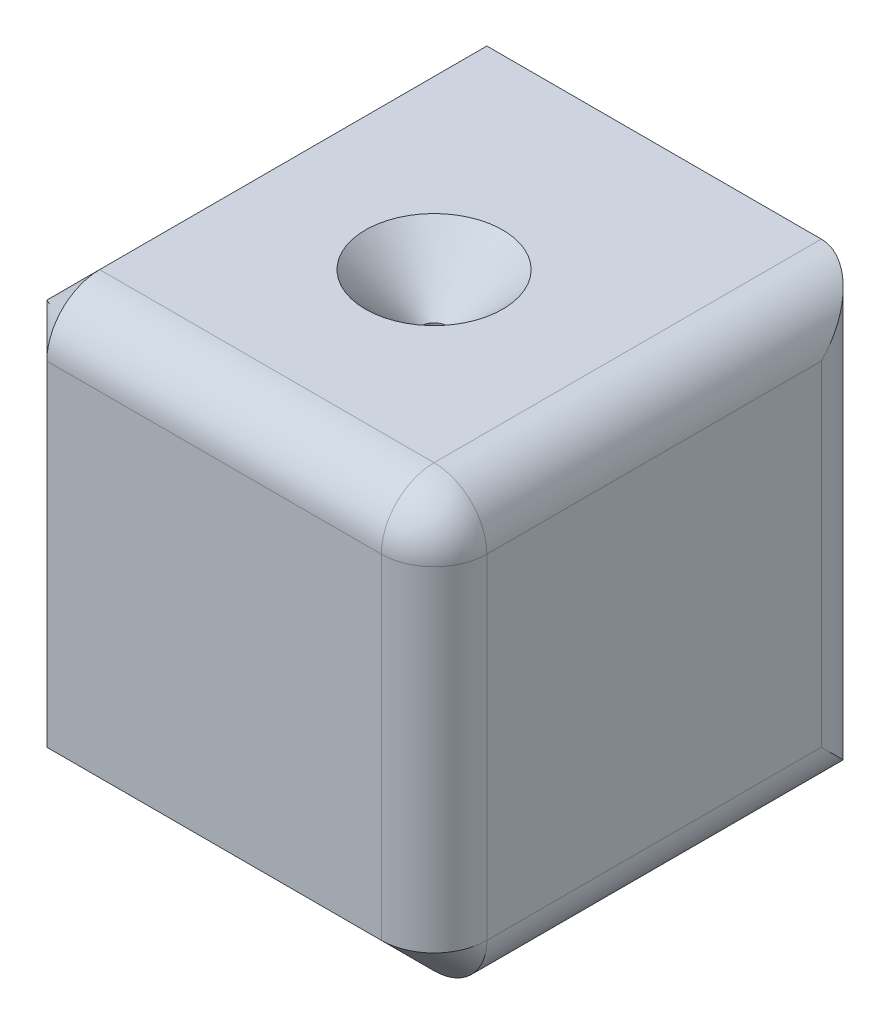
ISO-10303-21;
HEADER;
FILE_DESCRIPTION(('STEP AP214'),'2;1');
FILE_NAME('part.step','',(''),(''),'','','');
FILE_SCHEMA(('AUTOMOTIVE_DESIGN { 1 0 10303 214 1 1 1 1 }'));
ENDSEC;
DATA;
#1=APPLICATION_CONTEXT('core data for automotive mechanical design processes');
#2=APPLICATION_PROTOCOL_DEFINITION('international standard','automotive_design',2000,#1);
#3=PRODUCT_CONTEXT('',#1,'mechanical');
#4=PRODUCT('Part','Part','',(#3));
#5=PRODUCT_RELATED_PRODUCT_CATEGORY('part','',(#4));
#6=PRODUCT_DEFINITION_FORMATION('','',#4);
#7=PRODUCT_DEFINITION_CONTEXT('part definition',#1,'design');
#8=PRODUCT_DEFINITION('design','',#6,#7);
#9=PRODUCT_DEFINITION_SHAPE('','',#8);
#10=(LENGTH_UNIT() NAMED_UNIT(*) SI_UNIT(.MILLI.,.METRE.));
#11=(NAMED_UNIT(*) PLANE_ANGLE_UNIT() SI_UNIT($,.RADIAN.));
#12=(NAMED_UNIT(*) SI_UNIT($,.STERADIAN.) SOLID_ANGLE_UNIT());
#13=UNCERTAINTY_MEASURE_WITH_UNIT(LENGTH_MEASURE(1.E-05),#10,'distance_accuracy_value','');
#14=(GEOMETRIC_REPRESENTATION_CONTEXT(3) GLOBAL_UNCERTAINTY_ASSIGNED_CONTEXT((#13)) GLOBAL_UNIT_ASSIGNED_CONTEXT((#10,
#11,#12)) REPRESENTATION_CONTEXT('',''));
#15=CARTESIAN_POINT('',(0.,0.,0.));
#16=DIRECTION('',(0.,0.,1.));
#17=DIRECTION('',(1.,0.,0.));
#18=AXIS2_PLACEMENT_3D('',#15,#16,#17);
#19=CARTESIAN_POINT('',(0.,0.,25.));
#20=DIRECTION('',(1.,0.,0.));
#21=DIRECTION('',(0.,0.,-1.));
#22=AXIS2_PLACEMENT_3D('',#19,#20,#21);
#23=PLANE('',#22);
#24=DIRECTION('',(0.,0.,-1.));
#25=VECTOR('',#24,1.);
#26=CARTESIAN_POINT('',(0.,22.,25.));
#27=LINE('',#26,#25);
#28=CARTESIAN_POINT('',(0.,22.,22.));
#29=VERTEX_POINT('',#28);
#30=CARTESIAN_POINT('',(0.,22.,2.));
#31=VERTEX_POINT('',#30);
#32=EDGE_CURVE('E358',#29,#31,#27,.T.);
#33=ORIENTED_EDGE('',*,*,#32,.T.);
#34=CARTESIAN_POINT('',(0.,72.,2.));
#35=CARTESIAN_POINT('',(0.,55.3333333333333,2.));
#36=CARTESIAN_POINT('',(0.,38.6666666666667,2.));
#37=CARTESIAN_POINT('',(0.,22.,2.));
#38=CARTESIAN_POINT('',(0.,20.1666666666667,2.));
#39=CARTESIAN_POINT('',(0.,18.3333333333333,1.));
#40=CARTESIAN_POINT('',(0.,16.5,1.));
#41=CARTESIAN_POINT('',(0.,11.,1.));
#42=CARTESIAN_POINT('',(0.,5.49999999999999,4.));
#43=CARTESIAN_POINT('',(0.,0.,4.));
#44=CARTESIAN_POINT('',(0.,-16.,4.));
#45=CARTESIAN_POINT('',(0.,-32.,4.));
#46=CARTESIAN_POINT('',(0.,-48.,4.));
#47=(BOUNDED_CURVE() B_SPLINE_CURVE(3,(#34,#35,#36,#37,#38,#39,#40,#41,#42,#43,#44,#45,#46),
.UNSPECIFIED.,.F.,.F.) B_SPLINE_CURVE_WITH_KNOTS((4,3,3,3,4),(-0.072,-0.022,-0.0165,0.,0.048),
.UNSPECIFIED.) CURVE() GEOMETRIC_REPRESENTATION_ITEM() RATIONAL_B_SPLINE_CURVE((1.,1.,1.,1.,1.,
1.,1.,1.,1.,1.,1.,1.,1.)) REPRESENTATION_ITEM(''));
#48=CARTESIAN_POINT('',(0.,0.,4.));
#49=VERTEX_POINT('',#48);
#50=EDGE_CURVE('E229',#31,#49,#47,.T.);
#51=ORIENTED_EDGE('',*,*,#50,.T.);
#52=DIRECTION('',(0.,0.,-1.));
#53=VECTOR('',#52,1.);
#54=CARTESIAN_POINT('',(0.,0.,25.));
#55=LINE('',#54,#53);
#56=CARTESIAN_POINT('',(0.,0.,22.));
#57=VERTEX_POINT('',#56);
#58=EDGE_CURVE('E148',#57,#49,#55,.T.);
#59=ORIENTED_EDGE('',*,*,#58,.F.);
#60=DIRECTION('',(0.,1.,0.));
#61=VECTOR('',#60,1.);
#62=CARTESIAN_POINT('',(0.,0.,22.));
#63=LINE('',#62,#61);
#64=EDGE_CURVE('E361',#57,#29,#63,.T.);
#65=ORIENTED_EDGE('',*,*,#64,.T.);
#66=EDGE_LOOP('',(#33,#51,#59,#65));
#67=FACE_BOUND('',#66,.T.);
#68=ADVANCED_FACE('F43',(#67),#23,.F.);
#69=CARTESIAN_POINT('',(0.,0.,25.));
#70=DIRECTION('',(0.,1.,0.));
#71=DIRECTION('',(0.,0.,1.));
#72=AXIS2_PLACEMENT_3D('',#69,#70,#71);
#73=PLANE('',#72);
#74=CARTESIAN_POINT('',(12.5,0.,12.5));
#75=DIRECTION('',(0.,1.,0.));
#76=DIRECTION('',(0.,0.,1.));
#77=AXIS2_PLACEMENT_3D('',#74,#75,#76);
#78=CIRCLE('',#77,0.749999999999997);
#79=CARTESIAN_POINT('',(12.5,0.,13.25));
#80=VERTEX_POINT('',#79);
#81=EDGE_CURVE('E200',#80,#80,#78,.T.);
#82=ORIENTED_EDGE('',*,*,#81,.T.);
#83=EDGE_LOOP('',(#82));
#84=FACE_BOUND('',#83,.T.);
#85=ORIENTED_EDGE('',*,*,#58,.T.);
#86=CARTESIAN_POINT('',(0.,0.,4.));
#87=CARTESIAN_POINT('',(-1.07801650055505E-05,0.,3.88749351533069));
#88=CARTESIAN_POINT('',(0.00474660216352325,0.,3.77499214031857));
#89=CARTESIAN_POINT('',(0.0237142676639782,0.,3.55079431915907));
#90=CARTESIAN_POINT('',(0.0379240973846,0.,3.43909783465941));
#91=CARTESIAN_POINT('',(0.0756989713572863,0.,3.21737735873569));
#92=CARTESIAN_POINT('',(0.099256938530871,0.,3.10735216732034));
#93=CARTESIAN_POINT('',(0.155536996447878,0.,2.88970424637514));
#94=CARTESIAN_POINT('',(0.188258975324464,0.,2.78208148753564));
#95=CARTESIAN_POINT('',(0.299906592833127,0.,2.4638552761497));
#96=CARTESIAN_POINT('',(0.392329366770349,0.,2.2578036601231));
#97=CARTESIAN_POINT('',(0.610395015416492,0.,1.8642930528176));
#98=CARTESIAN_POINT('',(0.736032037981211,0.,1.67683079420276));
#99=CARTESIAN_POINT('',(1.01700181102197,0.,1.325628419682));
#100=CARTESIAN_POINT('',(1.17233427169146,0.,1.16188807229434));
#101=CARTESIAN_POINT('',(1.50831732546925,0.,0.862784943115788));
#102=CARTESIAN_POINT('',(1.68897286554306,0.,0.727427719008996));
#103=CARTESIAN_POINT('',(2.07046311746318,0.,0.488943692525063));
#104=CARTESIAN_POINT('',(2.27130176975455,0.,0.385823200096089));
#105=CARTESIAN_POINT('',(2.68740125719416,0.,0.214817855130698));
#106=CARTESIAN_POINT('',(2.90265356163622,0.,0.146912365149822));
#107=CARTESIAN_POINT('',(3.2660192610585,0.,0.0651394785829523));
#108=CARTESIAN_POINT('',(3.41184681111315,0.,0.0407269308072327));
#109=CARTESIAN_POINT('',(3.70509586554667,0.,0.00815932773058737));
#110=CARTESIAN_POINT('',(3.8525148110416,0.,-1.87754480882476E-05));
#111=CARTESIAN_POINT('',(4.,0.,0.));
#112=B_SPLINE_CURVE_WITH_KNOTS('',3,(#86,#87,#88,#89,#90,#91,#92,#93,#94,#95,#96,#97,#98,#99,
#100,#101,#102,#103,#104,#105,#106,#107,#108,#109,#110,#111),.UNSPECIFIED.,.F.,.F.,(4,2,2,2,2,2,
2,2,2,2,2,2,4),(0.,0.337409690213686,0.674803195430495,1.01194176015819,1.34907620955064,
2.02307394016271,2.69695299561842,3.37082547482512,4.04482978167747,4.71896593419016,
5.39270656736782,5.83543557899262,6.27753560189516),.UNSPECIFIED.);
#113=CARTESIAN_POINT('',(4.,0.,0.));
#114=VERTEX_POINT('',#113);
#115=EDGE_CURVE('E73',#49,#114,#112,.T.);
#116=ORIENTED_EDGE('',*,*,#115,.T.);
#117=DIRECTION('',(1.,0.,0.));
#118=VECTOR('',#117,1.);
#119=CARTESIAN_POINT('',(0.,0.,0.));
#120=LINE('',#119,#118);
#121=CARTESIAN_POINT('',(22.,0.,0.));
#122=VERTEX_POINT('',#121);
#123=EDGE_CURVE('E198',#114,#122,#120,.T.);
#124=ORIENTED_EDGE('',*,*,#123,.T.);
#125=DIRECTION('',(0.,0.,-1.));
#126=VECTOR('',#125,1.);
#127=CARTESIAN_POINT('',(22.,0.,25.));
#128=LINE('',#127,#126);
#129=CARTESIAN_POINT('',(22.,0.,22.));
#130=VERTEX_POINT('',#129);
#131=EDGE_CURVE('E135',#122,#130,#128,.F.);
#132=ORIENTED_EDGE('',*,*,#131,.T.);
#133=DIRECTION('',(-1.,0.,0.));
#134=VECTOR('',#133,1.);
#135=CARTESIAN_POINT('',(0.,0.,22.));
#136=LINE('',#135,#134);
#137=EDGE_CURVE('E363',#130,#57,#136,.T.);
#138=ORIENTED_EDGE('',*,*,#137,.T.);
#139=EDGE_LOOP('',(#85,#116,#124,#132,#138));
#140=FACE_BOUND('',#139,.T.);
#141=ADVANCED_FACE('F316',(#84,#140),#73,.F.);
#142=CARTESIAN_POINT('',(25.,0.,25.));
#143=DIRECTION('',(-1.,0.,0.));
#144=DIRECTION('',(0.,0.,1.));
#145=AXIS2_PLACEMENT_3D('',#142,#143,#144);
#146=PLANE('',#145);
#147=DIRECTION('',(0.,1.,0.));
#148=VECTOR('',#147,1.);
#149=CARTESIAN_POINT('',(25.,0.,22.));
#150=LINE('',#149,#148);
#151=CARTESIAN_POINT('',(25.,22.,22.));
#152=VERTEX_POINT('',#151);
#153=CARTESIAN_POINT('',(25.,3.,22.));
#154=VERTEX_POINT('',#153);
#155=EDGE_CURVE('E153',#152,#154,#150,.F.);
#156=ORIENTED_EDGE('',*,*,#155,.T.);
#157=DIRECTION('',(0.,0.,-1.));
#158=VECTOR('',#157,1.);
#159=CARTESIAN_POINT('',(25.,3.,25.));
#160=LINE('',#159,#158);
#161=CARTESIAN_POINT('',(25.,3.,3.));
#162=VERTEX_POINT('',#161);
#163=EDGE_CURVE('E132',#154,#162,#160,.T.);
#164=ORIENTED_EDGE('',*,*,#163,.T.);
#165=DIRECTION('',(0.,1.,0.));
#166=VECTOR('',#165,1.);
#167=CARTESIAN_POINT('',(25.,25.,3.));
#168=LINE('',#167,#166);
#169=CARTESIAN_POINT('',(25.,22.,3.));
#170=VERTEX_POINT('',#169);
#171=EDGE_CURVE('E142',#162,#170,#168,.T.);
#172=ORIENTED_EDGE('',*,*,#171,.T.);
#173=DIRECTION('',(0.,0.,-1.));
#174=VECTOR('',#173,1.);
#175=CARTESIAN_POINT('',(25.,22.,25.));
#176=LINE('',#175,#174);
#177=EDGE_CURVE('E147',#170,#152,#176,.F.);
#178=ORIENTED_EDGE('',*,*,#177,.T.);
#179=EDGE_LOOP('',(#156,#164,#172,#178));
#180=FACE_BOUND('',#179,.T.);
#181=ADVANCED_FACE('F151',(#180),#146,.F.);
#182=CARTESIAN_POINT('',(0.,25.,25.));
#183=DIRECTION('',(0.,-1.,0.));
#184=DIRECTION('',(0.,0.,-1.));
#185=AXIS2_PLACEMENT_3D('',#182,#183,#184);
#186=PLANE('',#185);
#187=CARTESIAN_POINT('',(12.5,25.,12.5));
#188=DIRECTION('',(0.,1.,0.));
#189=DIRECTION('',(0.,0.,1.));
#190=AXIS2_PLACEMENT_3D('',#187,#188,#189);
#191=CIRCLE('',#190,3.9);
#192=CARTESIAN_POINT('',(12.5,25.,16.4));
#193=VERTEX_POINT('',#192);
#194=EDGE_CURVE('E188',#193,#193,#191,.T.);
#195=ORIENTED_EDGE('',*,*,#194,.F.);
#196=EDGE_LOOP('',(#195));
#197=FACE_BOUND('',#196,.T.);
#198=DIRECTION('',(-1.,0.,0.));
#199=VECTOR('',#198,1.);
#200=CARTESIAN_POINT('',(0.,25.,0.));
#201=LINE('',#200,#199);
#202=CARTESIAN_POINT('',(22.,25.,0.));
#203=VERTEX_POINT('',#202);
#204=CARTESIAN_POINT('',(3.00000000000001,25.,0.));
#205=VERTEX_POINT('',#204);
#206=EDGE_CURVE('E195',#203,#205,#201,.T.);
#207=ORIENTED_EDGE('',*,*,#206,.T.);
#208=DIRECTION('',(0.,0.,1.));
#209=VECTOR('',#208,1.);
#210=CARTESIAN_POINT('',(3.00000000000001,25.,25.));
#211=LINE('',#210,#209);
#212=CARTESIAN_POINT('',(3.00000000000001,25.,22.));
#213=VERTEX_POINT('',#212);
#214=EDGE_CURVE('E218',#205,#213,#211,.T.);
#215=ORIENTED_EDGE('',*,*,#214,.T.);
#216=DIRECTION('',(-1.,0.,0.));
#217=VECTOR('',#216,1.);
#218=CARTESIAN_POINT('',(0.,25.,22.));
#219=LINE('',#218,#217);
#220=CARTESIAN_POINT('',(22.,25.,22.));
#221=VERTEX_POINT('',#220);
#222=EDGE_CURVE('E166',#213,#221,#219,.F.);
#223=ORIENTED_EDGE('',*,*,#222,.T.);
#224=DIRECTION('',(0.,0.,-1.));
#225=VECTOR('',#224,1.);
#226=CARTESIAN_POINT('',(22.,25.,25.));
#227=LINE('',#226,#225);
#228=EDGE_CURVE('E173',#221,#203,#227,.T.);
#229=ORIENTED_EDGE('',*,*,#228,.T.);
#230=EDGE_LOOP('',(#207,#215,#223,#229));
#231=FACE_BOUND('',#230,.T.);
#232=ADVANCED_FACE('F211',(#197,#231),#186,.F.);
#233=CARTESIAN_POINT('',(0.,0.,25.));
#234=DIRECTION('',(0.,0.,-1.));
#235=DIRECTION('',(-1.,0.,0.));
#236=AXIS2_PLACEMENT_3D('',#233,#234,#235);
#237=PLANE('',#236);
#238=DIRECTION('',(-1.,0.,0.));
#239=VECTOR('',#238,1.);
#240=CARTESIAN_POINT('',(0.,22.,25.));
#241=LINE('',#240,#239);
#242=CARTESIAN_POINT('',(22.,22.,25.));
#243=VERTEX_POINT('',#242);
#244=CARTESIAN_POINT('',(3.00000000000001,22.,25.));
#245=VERTEX_POINT('',#244);
#246=EDGE_CURVE('E155',#243,#245,#241,.T.);
#247=ORIENTED_EDGE('',*,*,#246,.T.);
#248=DIRECTION('',(0.,-1.,0.));
#249=VECTOR('',#248,1.);
#250=CARTESIAN_POINT('',(3.00000000000001,0.,25.));
#251=LINE('',#250,#249);
#252=CARTESIAN_POINT('',(3.00000000000001,3.00000000000001,25.));
#253=VERTEX_POINT('',#252);
#254=EDGE_CURVE('E354',#245,#253,#251,.T.);
#255=ORIENTED_EDGE('',*,*,#254,.T.);
#256=DIRECTION('',(1.,0.,0.));
#257=VECTOR('',#256,1.);
#258=CARTESIAN_POINT('',(0.,3.00000000000001,25.));
#259=LINE('',#258,#257);
#260=CARTESIAN_POINT('',(22.,3.00000000000001,25.));
#261=VERTEX_POINT('',#260);
#262=EDGE_CURVE('E347',#253,#261,#259,.T.);
#263=ORIENTED_EDGE('',*,*,#262,.T.);
#264=DIRECTION('',(0.,1.,0.));
#265=VECTOR('',#264,1.);
#266=CARTESIAN_POINT('',(22.,0.,25.));
#267=LINE('',#266,#265);
#268=EDGE_CURVE('E163',#261,#243,#267,.T.);
#269=ORIENTED_EDGE('',*,*,#268,.T.);
#270=EDGE_LOOP('',(#247,#255,#263,#269));
#271=FACE_BOUND('',#270,.T.);
#272=ADVANCED_FACE('F214',(#271),#237,.F.);
#273=CARTESIAN_POINT('',(0.,0.,0.));
#274=DIRECTION('',(0.,0.,-1.));
#275=DIRECTION('',(-1.,0.,0.));
#276=AXIS2_PLACEMENT_3D('',#273,#274,#275);
#277=PLANE('',#276);
#278=ORIENTED_EDGE('',*,*,#123,.F.);
#279=CARTESIAN_POINT('',(2.,72.,0.));
#280=CARTESIAN_POINT('',(2.,55.3333333333333,0.));
#281=CARTESIAN_POINT('',(2.,38.6666666666667,0.));
#282=CARTESIAN_POINT('',(2.,22.,0.));
#283=CARTESIAN_POINT('',(2.,20.1666666666667,0.));
#284=CARTESIAN_POINT('',(1.,18.3333333333333,0.));
#285=CARTESIAN_POINT('',(1.,16.5,0.));
#286=CARTESIAN_POINT('',(1.,11.,0.));
#287=CARTESIAN_POINT('',(4.,5.49999999999999,0.));
#288=CARTESIAN_POINT('',(4.,0.,0.));
#289=CARTESIAN_POINT('',(4.,-16.,0.));
#290=CARTESIAN_POINT('',(4.,-32.,0.));
#291=CARTESIAN_POINT('',(4.,-48.,0.));
#292=(BOUNDED_CURVE() B_SPLINE_CURVE(3,(#279,#280,#281,#282,#283,#284,#285,#286,#287,#288,#289,
#290,#291),.UNSPECIFIED.,.F.,.F.) B_SPLINE_CURVE_WITH_KNOTS((4,3,3,3,4),(-0.072,-0.022,-0.0165,
0.,0.048),.UNSPECIFIED.) CURVE() GEOMETRIC_REPRESENTATION_ITEM() RATIONAL_B_SPLINE_CURVE((1.,1.,
1.,1.,1.,1.,1.,1.,1.,1.,1.,1.,1.)) REPRESENTATION_ITEM(''));
#293=CARTESIAN_POINT('',(2.,24.,0.));
#294=VERTEX_POINT('',#293);
#295=EDGE_CURVE('E59',#114,#294,#292,.F.);
#296=ORIENTED_EDGE('',*,*,#295,.T.);
#297=DIRECTION('',(-0.707106781186548,-0.707106781186548,0.));
#298=VECTOR('',#297,1.);
#299=CARTESIAN_POINT('',(-11.,11.,0.));
#300=LINE('',#299,#298);
#301=EDGE_CURVE('E224',#294,#205,#300,.F.);
#302=ORIENTED_EDGE('',*,*,#301,.T.);
#303=ORIENTED_EDGE('',*,*,#206,.F.);
#304=DIRECTION('',(0.,1.,0.));
#305=VECTOR('',#304,1.);
#306=CARTESIAN_POINT('',(22.,0.,0.));
#307=LINE('',#306,#305);
#308=EDGE_CURVE('E175',#203,#122,#307,.F.);
#309=ORIENTED_EDGE('',*,*,#308,.T.);
#310=EDGE_LOOP('',(#278,#296,#302,#303,#309));
#311=FACE_BOUND('',#310,.T.);
#312=ADVANCED_FACE('F387',(#311),#277,.T.);
#313=CARTESIAN_POINT('',(12.5,25.,12.5));
#314=DIRECTION('',(0.,1.,0.));
#315=DIRECTION('',(0.,0.,1.));
#316=AXIS2_PLACEMENT_3D('',#313,#314,#315);
#317=CYLINDRICAL_SURFACE('',#316,0.749999999999997);
#318=ORIENTED_EDGE('',*,*,#81,.F.);
#319=EDGE_LOOP('',(#318));
#320=FACE_BOUND('',#319,.T.);
#321=CARTESIAN_POINT('',(12.5,21.85,12.5));
#322=DIRECTION('',(0.,1.,0.));
#323=DIRECTION('',(0.,0.,1.));
#324=AXIS2_PLACEMENT_3D('',#321,#322,#323);
#325=CIRCLE('',#324,0.749999999999997);
#326=CARTESIAN_POINT('',(12.5,21.85,13.25));
#327=VERTEX_POINT('',#326);
#328=EDGE_CURVE('E203',#327,#327,#325,.T.);
#329=ORIENTED_EDGE('',*,*,#328,.T.);
#330=EDGE_LOOP('',(#329));
#331=FACE_BOUND('',#330,.T.);
#332=ADVANCED_FACE('F455',(#320,#331),#317,.F.);
#333=CARTESIAN_POINT('',(12.5,25.,12.5));
#334=DIRECTION('',(0.,1.,0.));
#335=DIRECTION('',(0.,0.,1.));
#336=AXIS2_PLACEMENT_3D('',#333,#334,#335);
#337=CONICAL_SURFACE('',#336,3.9,0.785398163397443);
#338=CARTESIAN_POINT('',(12.5,21.85,13.25));
#339=CARTESIAN_POINT('',(12.5,21.8828125,13.2828125));
#340=CARTESIAN_POINT('',(12.5,21.915625,13.315625));
#341=CARTESIAN_POINT('',(12.5,21.98125,13.38125));
#342=CARTESIAN_POINT('',(12.5,22.0140625,13.4140625));
#343=CARTESIAN_POINT('',(12.5,22.0796875,13.4796875));
#344=CARTESIAN_POINT('',(12.5,22.1125,13.5125));
#345=CARTESIAN_POINT('',(12.5,22.178125,13.578125));
#346=CARTESIAN_POINT('',(12.5,22.2109375,13.6109375));
#347=CARTESIAN_POINT('',(12.5,22.2765625,13.6765625));
#348=CARTESIAN_POINT('',(12.5,22.309375,13.709375));
#349=CARTESIAN_POINT('',(12.5,22.375,13.775));
#350=CARTESIAN_POINT('',(12.5,22.4078125,13.8078125));
#351=CARTESIAN_POINT('',(12.5,22.4734375,13.8734375));
#352=CARTESIAN_POINT('',(12.5,22.50625,13.90625));
#353=CARTESIAN_POINT('',(12.5,22.571875,13.971875));
#354=CARTESIAN_POINT('',(12.5,22.6046875,14.0046875));
#355=CARTESIAN_POINT('',(12.5,22.6703125,14.0703125));
#356=CARTESIAN_POINT('',(12.5,22.703125,14.103125));
#357=CARTESIAN_POINT('',(12.5,22.76875,14.16875));
#358=CARTESIAN_POINT('',(12.5,22.8015625,14.2015625));
#359=CARTESIAN_POINT('',(12.5,22.8671875,14.2671875));
#360=CARTESIAN_POINT('',(12.5,22.9,14.3));
#361=CARTESIAN_POINT('',(12.5,22.965625,14.365625));
#362=CARTESIAN_POINT('',(12.5,22.9984375,14.3984375));
#363=CARTESIAN_POINT('',(12.5,23.0640625,14.4640625));
#364=CARTESIAN_POINT('',(12.5,23.096875,14.496875));
#365=CARTESIAN_POINT('',(12.5,23.1625,14.5625));
#366=CARTESIAN_POINT('',(12.5,23.1953125,14.5953125));
#367=CARTESIAN_POINT('',(12.5,23.2609375,14.6609375));
#368=CARTESIAN_POINT('',(12.5,23.29375,14.69375));
#369=CARTESIAN_POINT('',(12.5,23.359375,14.759375));
#370=CARTESIAN_POINT('',(12.5,23.3921875,14.7921875));
#371=CARTESIAN_POINT('',(12.5,23.4578125,14.8578125));
#372=CARTESIAN_POINT('',(12.5,23.490625,14.890625));
#373=CARTESIAN_POINT('',(12.5,23.55625,14.95625));
#374=CARTESIAN_POINT('',(12.5,23.5890625,14.9890625));
#375=CARTESIAN_POINT('',(12.5,23.6546875,15.0546875));
#376=CARTESIAN_POINT('',(12.5,23.6875,15.0875));
#377=CARTESIAN_POINT('',(12.5,23.753125,15.153125));
#378=CARTESIAN_POINT('',(12.5,23.7859375,15.1859375));
#379=CARTESIAN_POINT('',(12.5,23.8515625,15.2515625));
#380=CARTESIAN_POINT('',(12.5,23.884375,15.284375));
#381=CARTESIAN_POINT('',(12.5,23.95,15.35));
#382=CARTESIAN_POINT('',(12.5,23.9828125,15.3828125));
#383=CARTESIAN_POINT('',(12.5,24.0484375,15.4484375));
#384=CARTESIAN_POINT('',(12.5,24.08125,15.48125));
#385=CARTESIAN_POINT('',(12.5,24.146875,15.546875));
#386=CARTESIAN_POINT('',(12.5,24.1796875,15.5796875));
#387=CARTESIAN_POINT('',(12.5,24.2453125,15.6453125));
#388=CARTESIAN_POINT('',(12.5,24.278125,15.678125));
#389=CARTESIAN_POINT('',(12.5,24.34375,15.74375));
#390=CARTESIAN_POINT('',(12.5,24.3765625,15.7765625));
#391=CARTESIAN_POINT('',(12.5,24.4421875,15.8421875));
#392=CARTESIAN_POINT('',(12.5,24.475,15.875));
#393=CARTESIAN_POINT('',(12.5,24.540625,15.940625));
#394=CARTESIAN_POINT('',(12.5,24.5734375,15.9734375));
#395=CARTESIAN_POINT('',(12.5,24.6390625,16.0390625));
#396=CARTESIAN_POINT('',(12.5,24.671875,16.071875));
#397=CARTESIAN_POINT('',(12.5,24.7375,16.1375));
#398=CARTESIAN_POINT('',(12.5,24.7703125,16.1703125));
#399=CARTESIAN_POINT('',(12.5,24.8359375,16.2359375));
#400=CARTESIAN_POINT('',(12.5,24.86875,16.26875));
#401=CARTESIAN_POINT('',(12.5,24.934375,16.334375));
#402=CARTESIAN_POINT('',(12.5,24.9671875,16.3671875));
#403=CARTESIAN_POINT('',(12.5,25.,16.4));
#404=B_SPLINE_CURVE_WITH_KNOTS('',3,(#338,#339,#340,#341,#342,#343,#344,#345,#346,#347,#348,
#349,#350,#351,#352,#353,#354,#355,#356,#357,#358,#359,#360,#361,#362,#363,#364,#365,#366,#367,
#368,#369,#370,#371,#372,#373,#374,#375,#376,#377,#378,#379,#380,#381,#382,#383,#384,#385,#386,
#387,#388,#389,#390,#391,#392,#393,#394,#395,#396,#397,#398,#399,#400,#401,#402,#403),
.UNSPECIFIED.,.F.,.F.,(4,2,2,2,2,2,2,2,2,2,2,2,2,2,2,2,2,2,2,2,2,2,2,2,2,2,2,2,2,2,2,2,4),(0.,
0.139211647546102,0.278423295092203,0.417634942638306,0.556846590184407,0.696058237730512,
0.835269885276613,0.974481532822714,1.11369318036882,1.25290482791492,1.39211647546102,
1.53132812300712,1.67053977055323,1.80975141809933,1.94896306564543,2.08817471319153,
2.22738636073764,2.36659800828374,2.50580965582984,2.64502130337594,2.78423295092205,
2.92344459846815,3.06265624601425,3.20186789356035,3.34107954110645,3.48029118865256,
3.61950283619866,3.75871448374476,3.89792613129087,4.03713777883697,4.17634942638307,
4.31556107392917,4.45477272147528),.UNSPECIFIED.);
#405=EDGE_CURVE('BSEAM209',#327,#193,#404,.T.);
#406=ORIENTED_EDGE('',*,*,#328,.F.);
#407=ORIENTED_EDGE('',*,*,#194,.T.);
#408=ORIENTED_EDGE('',*,*,#405,.T.);
#409=ORIENTED_EDGE('',*,*,#405,.F.);
#410=EDGE_LOOP('',(#406,#408,#407,#409));
#411=FACE_BOUND('',#410,.T.);
#412=ADVANCED_FACE('F209',(#411),#337,.F.);
#413=CARTESIAN_POINT('',(0.,22.,22.));
#414=DIRECTION('',(-1.,0.,0.));
#415=DIRECTION('',(0.,0.,1.));
#416=AXIS2_PLACEMENT_3D('',#413,#414,#415);
#417=CYLINDRICAL_SURFACE('',#416,3.);
#418=ORIENTED_EDGE('',*,*,#222,.F.);
#419=CARTESIAN_POINT('',(3.00000000000001,22.,22.));
#420=DIRECTION('',(1.,0.,0.));
#421=DIRECTION('',(0.,0.,-1.));
#422=AXIS2_PLACEMENT_3D('',#419,#420,#421);
#423=CIRCLE('',#422,3.);
#424=EDGE_CURVE('E233',#213,#245,#423,.T.);
#425=ORIENTED_EDGE('',*,*,#424,.T.);
#426=ORIENTED_EDGE('',*,*,#246,.F.);
#427=CARTESIAN_POINT('',(22.,22.,22.));
#428=DIRECTION('',(1.,0.,0.));
#429=DIRECTION('',(0.,0.,-1.));
#430=AXIS2_PLACEMENT_3D('',#427,#428,#429);
#431=CIRCLE('',#430,3.);
#432=EDGE_CURVE('E186',#221,#243,#431,.T.);
#433=ORIENTED_EDGE('',*,*,#432,.F.);
#434=EDGE_LOOP('',(#418,#425,#426,#433));
#435=FACE_BOUND('',#434,.T.);
#436=ADVANCED_FACE('F369',(#435),#417,.T.);
#437=CARTESIAN_POINT('',(22.,22.,22.));
#438=DIRECTION('',(0.,1.,0.));
#439=DIRECTION('',(0.,0.,1.));
#440=AXIS2_PLACEMENT_3D('',#437,#438,#439);
#441=SPHERICAL_SURFACE('',#440,3.);
#442=CARTESIAN_POINT('',(22.,22.,22.));
#443=DIRECTION('',(0.,1.,0.));
#444=DIRECTION('',(0.,0.,1.));
#445=AXIS2_PLACEMENT_3D('',#442,#443,#444);
#446=CIRCLE('',#445,3.);
#447=EDGE_CURVE('E180',#152,#243,#446,.F.);
#448=ORIENTED_EDGE('',*,*,#447,.F.);
#449=CARTESIAN_POINT('',(22.,22.,22.));
#450=DIRECTION('',(0.,0.,1.));
#451=DIRECTION('',(1.,0.,0.));
#452=AXIS2_PLACEMENT_3D('',#449,#450,#451);
#453=CIRCLE('',#452,3.);
#454=EDGE_CURVE('E183',#221,#152,#453,.F.);
#455=ORIENTED_EDGE('',*,*,#454,.F.);
#456=ORIENTED_EDGE('',*,*,#432,.T.);
#457=EDGE_LOOP('',(#448,#455,#456));
#458=FACE_BOUND('',#457,.T.);
#459=ADVANCED_FACE('F385',(#458),#441,.T.);
#460=CARTESIAN_POINT('',(22.,22.,25.));
#461=DIRECTION('',(0.,0.,-1.));
#462=DIRECTION('',(-1.,0.,0.));
#463=AXIS2_PLACEMENT_3D('',#460,#461,#462);
#464=CYLINDRICAL_SURFACE('',#463,3.);
#465=ORIENTED_EDGE('',*,*,#454,.T.);
#466=ORIENTED_EDGE('',*,*,#177,.F.);
#467=CARTESIAN_POINT('',(22.,22.,3.));
#468=DIRECTION('',(0.,-0.707106781186547,-0.707106781186547));
#469=DIRECTION('',(0.,-0.707106781186547,0.707106781186547));
#470=AXIS2_PLACEMENT_3D('',#467,#468,#469);
#471=ELLIPSE('',#470,4.24264068711928,3.);
#472=EDGE_CURVE('E138',#203,#170,#471,.T.);
#473=ORIENTED_EDGE('',*,*,#472,.F.);
#474=ORIENTED_EDGE('',*,*,#228,.F.);
#475=EDGE_LOOP('',(#465,#466,#473,#474));
#476=FACE_BOUND('',#475,.T.);
#477=ADVANCED_FACE('F341',(#476),#464,.T.);
#478=CARTESIAN_POINT('',(22.,0.,22.));
#479=DIRECTION('',(0.,1.,0.));
#480=DIRECTION('',(0.,0.,1.));
#481=AXIS2_PLACEMENT_3D('',#478,#479,#480);
#482=CYLINDRICAL_SURFACE('',#481,3.);
#483=ORIENTED_EDGE('',*,*,#268,.F.);
#484=CARTESIAN_POINT('',(25.,3.,22.));
#485=CARTESIAN_POINT('',(25.,3.,22.2778977561766));
#486=CARTESIAN_POINT('',(24.9603489607797,3.,22.554878178305));
#487=CARTESIAN_POINT('',(24.815474528059,3.,23.0698873511729));
#488=CARTESIAN_POINT('',(24.7109932523984,3.,23.3073564895324));
#489=CARTESIAN_POINT('',(24.4661440043677,3.,23.7253403012141));
#490=CARTESIAN_POINT('',(24.3262255694513,3.,23.9062260862826));
#491=CARTESIAN_POINT('',(24.0347585257967,3.,24.2146740242508));
#492=CARTESIAN_POINT('',(23.883200754588,3.,24.34261059027));
#493=CARTESIAN_POINT('',(23.5809008605497,3.,24.5563688952964));
#494=CARTESIAN_POINT('',(23.4300193540044,3.,24.6423472302576));
#495=CARTESIAN_POINT('',(23.1331336914065,3.,24.7826178816856));
#496=CARTESIAN_POINT('',(22.9870236855326,3.,24.8369397553792));
#497=CARTESIAN_POINT('',(22.5557143683683,3.,24.9632673295877));
#498=CARTESIAN_POINT('',(22.2775127693529,3.,25.));
#499=CARTESIAN_POINT('',(22.,3.,25.));
#500=B_SPLINE_CURVE_WITH_KNOTS('',3,(#484,#485,#486,#487,#488,#489,#490,#491,#492,#493,#494,
#495,#496,#497,#498,#499),.UNSPECIFIED.,.F.,.F.,(4,2,2,2,2,2,2,4),(1.5707963267949,
1.76714586764426,1.96349540849362,2.15984494934298,2.35619449019235,2.55254403104171,
2.74889357189107,3.14159265358979),.UNSPECIFIED.);
#501=EDGE_CURVE('E295',#261,#154,#500,.F.);
#502=ORIENTED_EDGE('',*,*,#501,.T.);
#503=ORIENTED_EDGE('',*,*,#155,.F.);
#504=ORIENTED_EDGE('',*,*,#447,.T.);
#505=EDGE_LOOP('',(#483,#502,#503,#504));
#506=FACE_BOUND('',#505,.T.);
#507=ADVANCED_FACE('F337',(#506),#482,.T.);
#508=CARTESIAN_POINT('',(22.,0.,3.));
#509=DIRECTION('',(0.,-1.,0.));
#510=DIRECTION('',(0.,0.,-1.));
#511=AXIS2_PLACEMENT_3D('',#508,#509,#510);
#512=CYLINDRICAL_SURFACE('',#511,3.);
#513=ORIENTED_EDGE('',*,*,#472,.T.);
#514=ORIENTED_EDGE('',*,*,#171,.F.);
#515=CARTESIAN_POINT('',(22.,3.,3.));
#516=DIRECTION('',(0.,-0.707106781186547,0.707106781186547));
#517=DIRECTION('',(0.,-0.707106781186547,-0.707106781186547));
#518=AXIS2_PLACEMENT_3D('',#515,#516,#517);
#519=ELLIPSE('',#518,4.24264068711928,3.);
#520=EDGE_CURVE('E127',#122,#162,#519,.T.);
#521=ORIENTED_EDGE('',*,*,#520,.F.);
#522=ORIENTED_EDGE('',*,*,#308,.F.);
#523=EDGE_LOOP('',(#513,#514,#521,#522));
#524=FACE_BOUND('',#523,.T.);
#525=ADVANCED_FACE('F143',(#524),#512,.T.);
#526=CARTESIAN_POINT('',(22.,3.,25.));
#527=DIRECTION('',(0.,0.,-1.));
#528=DIRECTION('',(-1.,0.,0.));
#529=AXIS2_PLACEMENT_3D('',#526,#527,#528);
#530=CYLINDRICAL_SURFACE('',#529,3.);
#531=ORIENTED_EDGE('',*,*,#163,.F.);
#532=CARTESIAN_POINT('',(22.,0.,22.));
#533=CARTESIAN_POINT('',(22.2775127693524,0.,22.));
#534=CARTESIAN_POINT('',(22.555714368369,0.0367326704125492,22.));
#535=CARTESIAN_POINT('',(22.9870236855322,0.163060244620709,22.));
#536=CARTESIAN_POINT('',(23.1331336914065,0.217382118314373,22.));
#537=CARTESIAN_POINT('',(23.4300193540044,0.357652769742398,22.));
#538=CARTESIAN_POINT('',(23.5809008605494,0.443631104703368,22.));
#539=CARTESIAN_POINT('',(23.8832007545883,0.657389409730261,22.));
#540=CARTESIAN_POINT('',(24.0347585257966,0.785325975749095,22.));
#541=CARTESIAN_POINT('',(24.3262255694515,1.09377391371752,22.));
#542=CARTESIAN_POINT('',(24.4661440043678,1.2746596987861,22.));
#543=CARTESIAN_POINT('',(24.7109932523983,1.69264351046735,22.));
#544=CARTESIAN_POINT('',(24.8154745280589,1.93011264882701,22.));
#545=CARTESIAN_POINT('',(24.9603489607798,2.44512182169513,22.));
#546=CARTESIAN_POINT('',(25.,2.72210224382335,22.));
#547=CARTESIAN_POINT('',(25.,2.99999999999999,22.));
#548=B_SPLINE_CURVE_WITH_KNOTS('',3,(#532,#533,#534,#535,#536,#537,#538,#539,#540,#541,#542,
#543,#544,#545,#546,#547),.UNSPECIFIED.,.F.,.F.,(4,2,2,2,2,2,2,4),(1.5707963267949,
1.96349540849362,2.15984494934298,2.35619449019235,2.55254403104171,2.74889357189107,
2.94524311274043,3.14159265358979),.UNSPECIFIED.);
#549=EDGE_CURVE('E177',#154,#130,#548,.F.);
#550=ORIENTED_EDGE('',*,*,#549,.T.);
#551=ORIENTED_EDGE('',*,*,#131,.F.);
#552=ORIENTED_EDGE('',*,*,#520,.T.);
#553=EDGE_LOOP('',(#531,#550,#551,#552));
#554=FACE_BOUND('',#553,.T.);
#555=ADVANCED_FACE('F129',(#554),#530,.T.);
#556=CARTESIAN_POINT('',(0.,22.,25.));
#557=DIRECTION('',(0.707106781186547,-0.707106781186547,0.));
#558=DIRECTION('',(0.,0.,-1.));
#559=AXIS2_PLACEMENT_3D('',#556,#557,#558);
#560=PLANE('',#559);
#561=ORIENTED_EDGE('',*,*,#301,.F.);
#562=CARTESIAN_POINT('',(2.,24.,0.));
#563=CARTESIAN_POINT('',(1.93633226644417,23.9363322664442,1.02789674428122E-05));
#564=CARTESIAN_POINT('',(1.87266170999927,23.8726617099993,0.00304081533114182));
#565=CARTESIAN_POINT('',(1.74557994020719,23.7455799402072,0.0152182870454219));
#566=CARTESIAN_POINT('',(1.68216888570378,23.6821688857038,0.0243685286927641));
#567=CARTESIAN_POINT('',(1.55543505007603,23.555435050076,0.04895953962074));
#568=CARTESIAN_POINT('',(1.49211704471451,23.4921170447145,0.0644501102464158));
#569=CARTESIAN_POINT('',(1.36646058635916,23.3664605863591,0.101863025117871));
#570=CARTESIAN_POINT('',(1.30412193910287,23.3041219391028,0.123784076419999));
#571=CARTESIAN_POINT('',(1.13068220213992,23.1306822021399,0.194761769670043));
#572=CARTESIAN_POINT('',(1.02106636052035,23.0210663605203,0.251402586199391));
#573=CARTESIAN_POINT('',(0.809531750874063,22.8095317508741,0.387988001732138));
#574=CARTESIAN_POINT('',(0.707592151304941,22.7075921513049,0.467866441968422));
#575=CARTESIAN_POINT('',(0.542575604733249,22.5425756047332,0.626998771764485));
#576=CARTESIAN_POINT('',(0.476592307716808,22.4765923077168,0.700206046291773));
#577=CARTESIAN_POINT('',(0.353419103734864,22.3534191037349,0.860291460756712));
#578=CARTESIAN_POINT('',(0.29621982864245,22.2962198286424,0.947154833524473));
#579=CARTESIAN_POINT('',(0.204831928450747,22.2048319284507,1.11432256889392));
#580=CARTESIAN_POINT('',(0.16833645125627,22.1683364512563,1.19209815065802));
#581=CARTESIAN_POINT('',(0.10485549856887,22.1048554985689,1.3550075035865));
#582=CARTESIAN_POINT('',(0.0778466816407446,22.0778466816407,1.44012256378461));
#583=CARTESIAN_POINT('',(0.0473341455514495,22.0473341455514,1.56569688097002));
#584=CARTESIAN_POINT('',(0.0392034923036809,22.0392034923037,1.60398624455087));
#585=CARTESIAN_POINT('',(0.0251532704092096,22.0251532704092,1.68137236980816));
#586=CARTESIAN_POINT('',(0.0192332714436564,22.0192332714436,1.72046897278469));
#587=CARTESIAN_POINT('',(0.00967768373698591,22.009677683737,1.79947702182895));
#588=CARTESIAN_POINT('',(0.00605711747512254,22.0060571174751,1.83939210259636));
#589=CARTESIAN_POINT('',(0.00121393642013528,22.0012139364201,1.91953618020126));
#590=CARTESIAN_POINT('',(-7.20153410021519E-06,21.9999927984659,1.95976535508064));
#591=CARTESIAN_POINT('',(0.,22.,2.));
#592=B_SPLINE_CURVE_WITH_KNOTS('',3,(#562,#563,#564,#565,#566,#567,#568,#569,#570,#571,#572,
#573,#574,#575,#576,#577,#578,#579,#580,#581,#582,#583,#584,#585,#586,#587,#588,#589,#590,#591),
.UNSPECIFIED.,.F.,.F.,(4,2,2,2,2,2,2,2,2,2,2,2,2,2,4),(0.,0.270073926043413,0.540293883083199,
0.812678359116128,1.0850081056987,1.57835401782953,2.07030886844911,2.42497421151046,
2.7792586384122,3.05825591701497,3.33656184781156,3.45639392506734,3.57620266402199,
3.69678628787298,3.81744410726062),.UNSPECIFIED.);
#593=EDGE_CURVE('E12',#294,#31,#592,.T.);
#594=ORIENTED_EDGE('',*,*,#593,.T.);
#595=ORIENTED_EDGE('',*,*,#32,.F.);
#596=DIRECTION('',(-0.707106781186547,-0.707106781186547,0.));
#597=VECTOR('',#596,1.);
#598=CARTESIAN_POINT('',(3.00000000000001,25.,22.));
#599=LINE('',#598,#597);
#600=EDGE_CURVE('E139',#213,#29,#599,.T.);
#601=ORIENTED_EDGE('',*,*,#600,.F.);
#602=ORIENTED_EDGE('',*,*,#214,.F.);
#603=EDGE_LOOP('',(#561,#594,#595,#601,#602));
#604=FACE_BOUND('',#603,.T.);
#605=ADVANCED_FACE('F223',(#604),#560,.F.);
#606=CARTESIAN_POINT('',(3.00000000000001,22.,22.));
#607=DIRECTION('',(1.,0.,0.));
#608=DIRECTION('',(0.,0.,-1.));
#609=AXIS2_PLACEMENT_3D('',#606,#607,#608);
#610=CONICAL_SURFACE('',#609,3.00000000000001,0.785398163397448);
#611=ORIENTED_EDGE('',*,*,#424,.F.);
#612=ORIENTED_EDGE('',*,*,#600,.T.);
#613=DIRECTION('',(-0.707106781186547,0.,-0.707106781186547));
#614=VECTOR('',#613,1.);
#615=CARTESIAN_POINT('',(3.00000000000001,22.,25.));
#616=LINE('',#615,#614);
#617=EDGE_CURVE('E240',#245,#29,#616,.T.);
#618=ORIENTED_EDGE('',*,*,#617,.F.);
#619=EDGE_LOOP('',(#611,#612,#618));
#620=FACE_BOUND('',#619,.T.);
#621=ADVANCED_FACE('F377',(#620),#610,.T.);
#622=CARTESIAN_POINT('',(3.00000000000001,0.,25.));
#623=DIRECTION('',(0.707106781186547,0.,-0.707106781186547));
#624=DIRECTION('',(0.,-1.,0.));
#625=AXIS2_PLACEMENT_3D('',#622,#623,#624);
#626=PLANE('',#625);
#627=ORIENTED_EDGE('',*,*,#617,.T.);
#628=ORIENTED_EDGE('',*,*,#64,.F.);
#629=DIRECTION('',(-0.577350269189626,-0.577350269189626,-0.577350269189626));
#630=VECTOR('',#629,1.);
#631=CARTESIAN_POINT('',(2.00000000000001,2.00000000000001,24.));
#632=LINE('',#631,#630);
#633=EDGE_CURVE('E237',#253,#57,#632,.T.);
#634=ORIENTED_EDGE('',*,*,#633,.F.);
#635=ORIENTED_EDGE('',*,*,#254,.F.);
#636=EDGE_LOOP('',(#627,#628,#634,#635));
#637=FACE_BOUND('',#636,.T.);
#638=ADVANCED_FACE('F275',(#637),#626,.F.);
#639=CARTESIAN_POINT('',(0.,3.00000000000001,25.));
#640=DIRECTION('',(0.,0.707106781186547,-0.707106781186547));
#641=DIRECTION('',(1.,0.,0.));
#642=AXIS2_PLACEMENT_3D('',#639,#640,#641);
#643=PLANE('',#642);
#644=ORIENTED_EDGE('',*,*,#633,.T.);
#645=ORIENTED_EDGE('',*,*,#137,.F.);
#646=CARTESIAN_POINT('',(22.,3.,25.));
#647=CARTESIAN_POINT('',(22.,0.,22.));
#648=B_SPLINE_CURVE_WITH_KNOTS('',1,(#646,#647),.UNSPECIFIED.,.F.,.F.,(2,2),(0.,1.),.UNSPECIFIED.);
#649=EDGE_CURVE('E241',#261,#130,#648,.T.);
#650=ORIENTED_EDGE('',*,*,#649,.F.);
#651=ORIENTED_EDGE('',*,*,#262,.F.);
#652=EDGE_LOOP('',(#644,#645,#650,#651));
#653=FACE_BOUND('',#652,.T.);
#654=ADVANCED_FACE('F272',(#653),#643,.F.);
#655=CARTESIAN_POINT('',(25.,2.99999999999999,22.));
#656=CARTESIAN_POINT('',(25.,2.72210224382335,22.));
#657=CARTESIAN_POINT('',(24.9603489607798,2.44512182169513,22.));
#658=CARTESIAN_POINT('',(24.8154745280589,1.93011264882701,22.));
#659=CARTESIAN_POINT('',(24.7109932523983,1.69264351046735,22.));
#660=CARTESIAN_POINT('',(24.4661440043678,1.2746596987861,22.));
#661=CARTESIAN_POINT('',(24.3262255694515,1.09377391371752,22.));
#662=CARTESIAN_POINT('',(24.0347585257966,0.785325975749095,22.));
#663=CARTESIAN_POINT('',(23.8832007545883,0.657389409730261,22.));
#664=CARTESIAN_POINT('',(23.5809008605494,0.443631104703368,22.));
#665=CARTESIAN_POINT('',(23.4300193540044,0.357652769742398,22.));
#666=CARTESIAN_POINT('',(23.1331336914065,0.217382118314373,22.));
#667=CARTESIAN_POINT('',(22.9870236855322,0.163060244620709,22.));
#668=CARTESIAN_POINT('',(22.555714368369,0.0367326704125492,22.));
#669=CARTESIAN_POINT('',(22.2775127693524,0.,22.));
#670=CARTESIAN_POINT('',(22.,0.,22.));
#671=CARTESIAN_POINT('',(25.,3.,22.));
#672=CARTESIAN_POINT('',(25.,3.,22.2778977561766));
#673=CARTESIAN_POINT('',(24.9603489607797,3.,22.554878178305));
#674=CARTESIAN_POINT('',(24.815474528059,3.,23.0698873511729));
#675=CARTESIAN_POINT('',(24.7109932523984,3.,23.3073564895324));
#676=CARTESIAN_POINT('',(24.4661440043677,3.,23.7253403012141));
#677=CARTESIAN_POINT('',(24.3262255694513,3.,23.9062260862826));
#678=CARTESIAN_POINT('',(24.0347585257967,3.,24.2146740242508));
#679=CARTESIAN_POINT('',(23.883200754588,3.,24.34261059027));
#680=CARTESIAN_POINT('',(23.5809008605497,3.,24.5563688952964));
#681=CARTESIAN_POINT('',(23.4300193540044,3.,24.6423472302576));
#682=CARTESIAN_POINT('',(23.1331336914065,3.,24.7826178816856));
#683=CARTESIAN_POINT('',(22.9870236855326,3.,24.8369397553792));
#684=CARTESIAN_POINT('',(22.5557143683683,3.,24.9632673295877));
#685=CARTESIAN_POINT('',(22.2775127693529,3.,25.));
#686=CARTESIAN_POINT('',(22.,3.,25.));
#687=B_SPLINE_SURFACE_WITH_KNOTS('',1,3,((#655,#656,#657,#658,#659,#660,#661,#662,#663,#664,
#665,#666,#667,#668,#669,#670),(#671,#672,#673,#674,#675,#676,#677,#678,#679,#680,#681,#682,
#683,#684,#685,#686)),.UNSPECIFIED.,.F.,.F.,.F.,(2,2),(4,2,2,2,2,2,2,4),(0.,1.),
(1.5707963267949,1.76714586764426,1.96349540849362,2.15984494934298,2.35619449019235,
2.55254403104171,2.74889357189107,3.14159265358979),.UNSPECIFIED.);
#688=ORIENTED_EDGE('',*,*,#549,.F.);
#689=ORIENTED_EDGE('',*,*,#501,.F.);
#690=ORIENTED_EDGE('',*,*,#649,.T.);
#691=EDGE_LOOP('',(#688,#689,#690));
#692=FACE_BOUND('',#691,.T.);
#693=ADVANCED_FACE('F256',(#692),#687,.T.);
#694=CARTESIAN_POINT('',(0.,28.9728,2.));
#695=CARTESIAN_POINT('',(0.,26.6485333333333,2.));
#696=CARTESIAN_POINT('',(0.,24.3242666666667,2.));
#697=CARTESIAN_POINT('',(0.,22.,2.));
#698=CARTESIAN_POINT('',(0.,20.1666666666667,2.));
#699=CARTESIAN_POINT('',(0.,18.3333333333333,1.));
#700=CARTESIAN_POINT('',(0.,16.5,1.));
#701=CARTESIAN_POINT('',(0.,11.,1.));
#702=CARTESIAN_POINT('',(0.,5.49999999999999,4.));
#703=CARTESIAN_POINT('',(0.,0.,4.));
#704=CARTESIAN_POINT('',(0.,-1.6096,4.));
#705=CARTESIAN_POINT('',(0.,-3.2192,4.));
#706=CARTESIAN_POINT('',(0.,-4.8288,4.));
#707=CARTESIAN_POINT('',(0.,28.9728,0.));
#708=CARTESIAN_POINT('',(0.,26.6485333333333,0.));
#709=CARTESIAN_POINT('',(0.,24.3242666666667,0.));
#710=CARTESIAN_POINT('',(0.,22.,0.));
#711=CARTESIAN_POINT('',(0.,20.1666666666667,0.));
#712=CARTESIAN_POINT('',(0.,18.3333333333333,0.));
#713=CARTESIAN_POINT('',(0.,16.5,0.));
#714=CARTESIAN_POINT('',(0.,11.,0.));
#715=CARTESIAN_POINT('',(0.,5.49999999999999,0.));
#716=CARTESIAN_POINT('',(0.,0.,0.));
#717=CARTESIAN_POINT('',(0.,-1.6096,0.));
#718=CARTESIAN_POINT('',(0.,-3.2192,0.));
#719=CARTESIAN_POINT('',(0.,-4.8288,0.));
#720=CARTESIAN_POINT('',(2.,28.9728,0.));
#721=CARTESIAN_POINT('',(2.,26.6485333333333,0.));
#722=CARTESIAN_POINT('',(2.,24.3242666666667,0.));
#723=CARTESIAN_POINT('',(2.,22.,0.));
#724=CARTESIAN_POINT('',(2.,20.1666666666667,0.));
#725=CARTESIAN_POINT('',(1.,18.3333333333333,0.));
#726=CARTESIAN_POINT('',(1.,16.5,0.));
#727=CARTESIAN_POINT('',(1.,11.,0.));
#728=CARTESIAN_POINT('',(4.,5.49999999999999,0.));
#729=CARTESIAN_POINT('',(4.,0.,0.));
#730=CARTESIAN_POINT('',(4.,-1.6096,0.));
#731=CARTESIAN_POINT('',(4.,-3.2192,0.));
#732=CARTESIAN_POINT('',(4.,-4.8288,0.));
#733=(BOUNDED_SURFACE() B_SPLINE_SURFACE(2,3,((#694,#695,#696,#697,#698,#699,#700,#701,#702,
#703,#704,#705,#706),(#707,#708,#709,#710,#711,#712,#713,#714,#715,#716,#717,#718,#719),(#720,
#721,#722,#723,#724,#725,#726,#727,#728,#729,#730,#731,#732)),.UNSPECIFIED.,.F.,.F.,
.F.) B_SPLINE_SURFACE_WITH_KNOTS((3,3),(4,3,3,3,4),(0.,1.),(-0.0289728,-0.022,-0.0165,0.,
0.00482879999999999),
.UNSPECIFIED.) GEOMETRIC_REPRESENTATION_ITEM() RATIONAL_B_SPLINE_SURFACE(((1.,1.,1.,1.,1.,1.,1.,
1.,1.,1.,1.,1.,1.),(0.707106781186548,0.707106781186548,0.707106781186548,0.707106781186548,
0.707106781186548,0.707106781186548,0.707106781186548,0.707106781186548,0.707106781186548,
0.707106781186548,0.707106781186548,0.707106781186548,0.707106781186548),(1.,1.,1.,1.,1.,1.,1.,
1.,1.,1.,1.,1.,1.))) REPRESENTATION_ITEM('') SURFACE());
#734=ORIENTED_EDGE('',*,*,#593,.F.);
#735=ORIENTED_EDGE('',*,*,#295,.F.);
#736=ORIENTED_EDGE('',*,*,#115,.F.);
#737=ORIENTED_EDGE('',*,*,#50,.F.);
#738=EDGE_LOOP('',(#734,#735,#736,#737));
#739=FACE_BOUND('',#738,.T.);
#740=ADVANCED_FACE('F46',(#739),#733,.T.);
#741=CLOSED_SHELL('',(#68,#141,#181,#232,#272,#312,#332,#412,#436,#459,#477,#507,#525,#555,#605,
#621,#638,#654,#693,#740));
#742=MANIFOLD_SOLID_BREP('B2',#741);
#743=ADVANCED_BREP_SHAPE_REPRESENTATION('',(#18,#742),#14);
#744=SHAPE_DEFINITION_REPRESENTATION(#9,#743);
ENDSEC;
END-ISO-10303-21;
